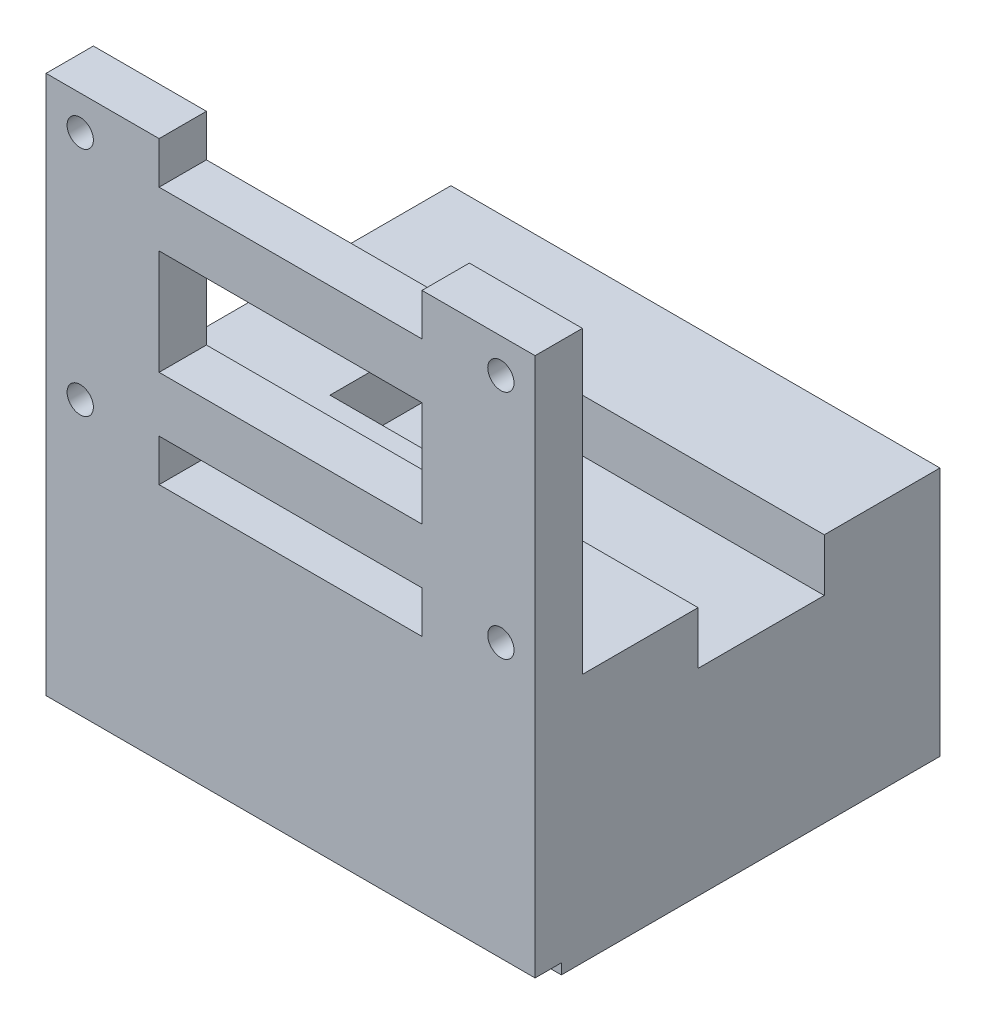
ISO-10303-21;
HEADER;
FILE_DESCRIPTION(('STEP AP214'),'2;1');
FILE_NAME('part.step','',(''),(''),'','','');
FILE_SCHEMA(('AUTOMOTIVE_DESIGN { 1 0 10303 214 1 1 1 1 }'));
ENDSEC;
DATA;
#1=APPLICATION_CONTEXT('core data for automotive mechanical design processes');
#2=APPLICATION_PROTOCOL_DEFINITION('international standard','automotive_design',2000,#1);
#3=PRODUCT_CONTEXT('',#1,'mechanical');
#4=PRODUCT('Part','Part','',(#3));
#5=PRODUCT_RELATED_PRODUCT_CATEGORY('part','',(#4));
#6=PRODUCT_DEFINITION_FORMATION('','',#4);
#7=PRODUCT_DEFINITION_CONTEXT('part definition',#1,'design');
#8=PRODUCT_DEFINITION('design','',#6,#7);
#9=PRODUCT_DEFINITION_SHAPE('','',#8);
#10=(LENGTH_UNIT() NAMED_UNIT(*) SI_UNIT(.MILLI.,.METRE.));
#11=(NAMED_UNIT(*) PLANE_ANGLE_UNIT() SI_UNIT($,.RADIAN.));
#12=(NAMED_UNIT(*) SI_UNIT($,.STERADIAN.) SOLID_ANGLE_UNIT());
#13=UNCERTAINTY_MEASURE_WITH_UNIT(LENGTH_MEASURE(1.E-05),#10,'distance_accuracy_value','');
#14=(GEOMETRIC_REPRESENTATION_CONTEXT(3) GLOBAL_UNCERTAINTY_ASSIGNED_CONTEXT((#13)) GLOBAL_UNIT_ASSIGNED_CONTEXT((#10,
#11,#12)) REPRESENTATION_CONTEXT('',''));
#15=CARTESIAN_POINT('',(0.,0.,0.));
#16=DIRECTION('',(0.,0.,1.));
#17=DIRECTION('',(1.,0.,0.));
#18=AXIS2_PLACEMENT_3D('',#15,#16,#17);
#19=CARTESIAN_POINT('',(-23.25,42.25,19.));
#20=DIRECTION('',(0.,-1.,0.));
#21=DIRECTION('',(0.,0.,-1.));
#22=AXIS2_PLACEMENT_3D('',#19,#20,#21);
#23=PLANE('',#22);
#24=DIRECTION('',(-1.,0.,0.));
#25=VECTOR('',#24,1.);
#26=CARTESIAN_POINT('',(-23.25,42.25,17.));
#27=LINE('',#26,#25);
#28=CARTESIAN_POINT('',(23.25,42.25,17.));
#29=VERTEX_POINT('',#28);
#30=CARTESIAN_POINT('',(12.5,42.25,17.));
#31=VERTEX_POINT('',#30);
#32=EDGE_CURVE('E497',#29,#31,#27,.T.);
#33=ORIENTED_EDGE('',*,*,#32,.T.);
#34=DIRECTION('',(0.,0.,-1.));
#35=VECTOR('',#34,1.);
#36=CARTESIAN_POINT('',(12.5,42.25,27.));
#37=LINE('',#36,#35);
#38=CARTESIAN_POINT('',(12.5,42.25,21.5));
#39=VERTEX_POINT('',#38);
#40=EDGE_CURVE('E322',#39,#31,#37,.T.);
#41=ORIENTED_EDGE('',*,*,#40,.F.);
#42=DIRECTION('',(-1.,0.,0.));
#43=VECTOR('',#42,1.);
#44=CARTESIAN_POINT('',(23.25,42.25,21.5));
#45=LINE('',#44,#43);
#46=CARTESIAN_POINT('',(23.25,42.25,21.5));
#47=VERTEX_POINT('',#46);
#48=EDGE_CURVE('E378',#47,#39,#45,.T.);
#49=ORIENTED_EDGE('',*,*,#48,.F.);
#50=DIRECTION('',(0.,0.,-1.));
#51=VECTOR('',#50,1.);
#52=CARTESIAN_POINT('',(23.25,42.25,19.));
#53=LINE('',#52,#51);
#54=EDGE_CURVE('E513',#47,#29,#53,.T.);
#55=ORIENTED_EDGE('',*,*,#54,.T.);
#56=EDGE_LOOP('',(#33,#41,#49,#55));
#57=FACE_BOUND('',#56,.T.);
#58=ADVANCED_FACE('F42',(#57),#23,.F.);
#59=CARTESIAN_POINT('',(0.,0.,19.));
#60=DIRECTION('',(0.,0.,-1.));
#61=DIRECTION('',(-1.,0.,0.));
#62=AXIS2_PLACEMENT_3D('',#59,#60,#61);
#63=PLANE('',#62);
#64=DIRECTION('',(1.,0.,0.));
#65=VECTOR('',#64,1.);
#66=CARTESIAN_POINT('',(23.25,-9.,19.));
#67=LINE('',#66,#65);
#68=CARTESIAN_POINT('',(-23.25,-9.,19.));
#69=VERTEX_POINT('',#68);
#70=CARTESIAN_POINT('',(23.25,-9.,19.));
#71=VERTEX_POINT('',#70);
#72=EDGE_CURVE('E395',#69,#71,#67,.T.);
#73=ORIENTED_EDGE('',*,*,#72,.F.);
#74=DIRECTION('',(0.,-1.,0.));
#75=VECTOR('',#74,1.);
#76=CARTESIAN_POINT('',(-23.25,0.,19.));
#77=LINE('',#76,#75);
#78=CARTESIAN_POINT('',(-23.25,-10.,19.));
#79=VERTEX_POINT('',#78);
#80=EDGE_CURVE('E493',#69,#79,#77,.T.);
#81=ORIENTED_EDGE('',*,*,#80,.T.);
#82=DIRECTION('',(-1.,0.,0.));
#83=VECTOR('',#82,1.);
#84=CARTESIAN_POINT('',(0.,-10.,19.));
#85=LINE('',#84,#83);
#86=CARTESIAN_POINT('',(23.25,-10.,19.));
#87=VERTEX_POINT('',#86);
#88=EDGE_CURVE('E430',#87,#79,#85,.T.);
#89=ORIENTED_EDGE('',*,*,#88,.F.);
#90=DIRECTION('',(0.,1.,0.));
#91=VECTOR('',#90,1.);
#92=CARTESIAN_POINT('',(23.25,0.,19.));
#93=LINE('',#92,#91);
#94=EDGE_CURVE('E496',#87,#71,#93,.T.);
#95=ORIENTED_EDGE('',*,*,#94,.T.);
#96=EDGE_LOOP('',(#73,#81,#89,#95));
#97=FACE_BOUND('',#96,.T.);
#98=ADVANCED_FACE('F593',(#97),#63,.F.);
#99=CARTESIAN_POINT('',(23.25,13.75,17.));
#100=DIRECTION('',(-1.,0.,0.));
#101=DIRECTION('',(0.,0.,1.));
#102=AXIS2_PLACEMENT_3D('',#99,#100,#101);
#103=PLANE('',#102);
#104=DIRECTION('',(0.,0.,-1.));
#105=VECTOR('',#104,1.);
#106=CARTESIAN_POINT('',(23.25,8.75,-6.));
#107=LINE('',#106,#105);
#108=CARTESIAN_POINT('',(23.25,8.75,6.));
#109=VERTEX_POINT('',#108);
#110=CARTESIAN_POINT('',(23.25,8.75,-6.));
#111=VERTEX_POINT('',#110);
#112=EDGE_CURVE('E453',#109,#111,#107,.T.);
#113=ORIENTED_EDGE('',*,*,#112,.F.);
#114=DIRECTION('',(0.,1.,0.));
#115=VECTOR('',#114,1.);
#116=CARTESIAN_POINT('',(23.25,8.75,6.));
#117=LINE('',#116,#115);
#118=CARTESIAN_POINT('',(23.25,13.75,6.));
#119=VERTEX_POINT('',#118);
#120=EDGE_CURVE('E480',#109,#119,#117,.T.);
#121=ORIENTED_EDGE('',*,*,#120,.T.);
#122=DIRECTION('',(0.,0.,-1.));
#123=VECTOR('',#122,1.);
#124=CARTESIAN_POINT('',(23.25,13.75,17.));
#125=LINE('',#124,#123);
#126=CARTESIAN_POINT('',(23.25,13.75,17.));
#127=VERTEX_POINT('',#126);
#128=EDGE_CURVE('E518',#127,#119,#125,.T.);
#129=ORIENTED_EDGE('',*,*,#128,.F.);
#130=DIRECTION('',(0.,1.,0.));
#131=VECTOR('',#130,1.);
#132=CARTESIAN_POINT('',(23.25,0.,17.));
#133=LINE('',#132,#131);
#134=EDGE_CURVE('E503',#127,#29,#133,.T.);
#135=ORIENTED_EDGE('',*,*,#134,.T.);
#136=ORIENTED_EDGE('',*,*,#54,.F.);
#137=DIRECTION('',(0.,-1.,0.));
#138=VECTOR('',#137,1.);
#139=CARTESIAN_POINT('',(23.25,42.25,21.5));
#140=LINE('',#139,#138);
#141=CARTESIAN_POINT('',(23.25,-9.,21.5));
#142=VERTEX_POINT('',#141);
#143=EDGE_CURVE('E382',#47,#142,#140,.T.);
#144=ORIENTED_EDGE('',*,*,#143,.T.);
#145=DIRECTION('',(0.,0.,1.));
#146=VECTOR('',#145,1.);
#147=CARTESIAN_POINT('',(23.25,-9.,19.));
#148=LINE('',#147,#146);
#149=EDGE_CURVE('E261',#71,#142,#148,.T.);
#150=ORIENTED_EDGE('',*,*,#149,.F.);
#151=ORIENTED_EDGE('',*,*,#94,.F.);
#152=DIRECTION('',(0.,0.,1.));
#153=VECTOR('',#152,1.);
#154=CARTESIAN_POINT('',(23.25,-10.,0.));
#155=LINE('',#154,#153);
#156=CARTESIAN_POINT('',(23.25,-10.,-17.));
#157=VERTEX_POINT('',#156);
#158=EDGE_CURVE('E426',#157,#87,#155,.T.);
#159=ORIENTED_EDGE('',*,*,#158,.F.);
#160=DIRECTION('',(0.,-1.,0.));
#161=VECTOR('',#160,1.);
#162=CARTESIAN_POINT('',(23.25,13.75,-17.));
#163=LINE('',#162,#161);
#164=CARTESIAN_POINT('',(23.25,13.75,-17.));
#165=VERTEX_POINT('',#164);
#166=EDGE_CURVE('E236',#165,#157,#163,.T.);
#167=ORIENTED_EDGE('',*,*,#166,.F.);
#168=CARTESIAN_POINT('',(23.25,13.75,-6.));
#169=VERTEX_POINT('',#168);
#170=EDGE_CURVE('E517',#169,#165,#125,.T.);
#171=ORIENTED_EDGE('',*,*,#170,.F.);
#172=DIRECTION('',(0.,1.,0.));
#173=VECTOR('',#172,1.);
#174=CARTESIAN_POINT('',(23.25,8.75,-6.));
#175=LINE('',#174,#173);
#176=EDGE_CURVE('E470',#111,#169,#175,.T.);
#177=ORIENTED_EDGE('',*,*,#176,.F.);
#178=EDGE_LOOP('',(#113,#121,#129,#135,#136,#144,#150,#151,#159,#167,#171,#177));
#179=FACE_BOUND('',#178,.T.);
#180=ADVANCED_FACE('F44',(#179),#103,.F.);
#181=CARTESIAN_POINT('',(-23.25,13.75,-17.));
#182=DIRECTION('',(0.,0.,1.));
#183=DIRECTION('',(1.,0.,0.));
#184=AXIS2_PLACEMENT_3D('',#181,#182,#183);
#185=PLANE('',#184);
#186=ORIENTED_EDGE('',*,*,#166,.T.);
#187=DIRECTION('',(1.,0.,0.));
#188=VECTOR('',#187,1.);
#189=CARTESIAN_POINT('',(0.,-10.,-17.));
#190=LINE('',#189,#188);
#191=CARTESIAN_POINT('',(-23.25,-10.,-17.));
#192=VERTEX_POINT('',#191);
#193=EDGE_CURVE('E422',#192,#157,#190,.T.);
#194=ORIENTED_EDGE('',*,*,#193,.F.);
#195=DIRECTION('',(0.,-1.,0.));
#196=VECTOR('',#195,1.);
#197=CARTESIAN_POINT('',(-23.25,13.75,-17.));
#198=LINE('',#197,#196);
#199=CARTESIAN_POINT('',(-23.25,13.75,-17.));
#200=VERTEX_POINT('',#199);
#201=EDGE_CURVE('E231',#200,#192,#198,.T.);
#202=ORIENTED_EDGE('',*,*,#201,.F.);
#203=DIRECTION('',(-1.,0.,0.));
#204=VECTOR('',#203,1.);
#205=CARTESIAN_POINT('',(-23.25,13.75,-17.));
#206=LINE('',#205,#204);
#207=EDGE_CURVE('E520',#165,#200,#206,.T.);
#208=ORIENTED_EDGE('',*,*,#207,.F.);
#209=EDGE_LOOP('',(#186,#194,#202,#208));
#210=FACE_BOUND('',#209,.T.);
#211=ADVANCED_FACE('F530',(#210),#185,.F.);
#212=CARTESIAN_POINT('',(-23.25,13.75,17.));
#213=DIRECTION('',(1.,0.,0.));
#214=DIRECTION('',(0.,0.,-1.));
#215=AXIS2_PLACEMENT_3D('',#212,#213,#214);
#216=PLANE('',#215);
#217=ORIENTED_EDGE('',*,*,#201,.T.);
#218=DIRECTION('',(0.,0.,-1.));
#219=VECTOR('',#218,1.);
#220=CARTESIAN_POINT('',(-23.25,-10.,0.));
#221=LINE('',#220,#219);
#222=EDGE_CURVE('E434',#79,#192,#221,.T.);
#223=ORIENTED_EDGE('',*,*,#222,.F.);
#224=ORIENTED_EDGE('',*,*,#80,.F.);
#225=DIRECTION('',(0.,0.,-1.));
#226=VECTOR('',#225,1.);
#227=CARTESIAN_POINT('',(-23.25,-9.,19.));
#228=LINE('',#227,#226);
#229=CARTESIAN_POINT('',(-23.25,-9.,21.5));
#230=VERTEX_POINT('',#229);
#231=EDGE_CURVE('E391',#230,#69,#228,.T.);
#232=ORIENTED_EDGE('',*,*,#231,.F.);
#233=DIRECTION('',(0.,-1.,0.));
#234=VECTOR('',#233,1.);
#235=CARTESIAN_POINT('',(-23.25,42.25,21.5));
#236=LINE('',#235,#234);
#237=CARTESIAN_POINT('',(-23.25,42.25,21.5));
#238=VERTEX_POINT('',#237);
#239=EDGE_CURVE('E399',#238,#230,#236,.T.);
#240=ORIENTED_EDGE('',*,*,#239,.F.);
#241=DIRECTION('',(0.,0.,-1.));
#242=VECTOR('',#241,1.);
#243=CARTESIAN_POINT('',(-23.25,42.25,19.));
#244=LINE('',#243,#242);
#245=CARTESIAN_POINT('',(-23.25,42.25,17.));
#246=VERTEX_POINT('',#245);
#247=EDGE_CURVE('E500',#238,#246,#244,.T.);
#248=ORIENTED_EDGE('',*,*,#247,.T.);
#249=DIRECTION('',(0.,-1.,0.));
#250=VECTOR('',#249,1.);
#251=CARTESIAN_POINT('',(-23.25,0.,17.));
#252=LINE('',#251,#250);
#253=CARTESIAN_POINT('',(-23.25,13.75,17.));
#254=VERTEX_POINT('',#253);
#255=EDGE_CURVE('E484',#246,#254,#252,.T.);
#256=ORIENTED_EDGE('',*,*,#255,.T.);
#257=DIRECTION('',(0.,0.,1.));
#258=VECTOR('',#257,1.);
#259=CARTESIAN_POINT('',(-23.25,13.75,17.));
#260=LINE('',#259,#258);
#261=EDGE_CURVE('E229',#200,#254,#260,.T.);
#262=ORIENTED_EDGE('',*,*,#261,.F.);
#263=EDGE_LOOP('',(#217,#223,#224,#232,#240,#248,#256,#262));
#264=FACE_BOUND('',#263,.T.);
#265=ADVANCED_FACE('F533',(#264),#216,.F.);
#266=CARTESIAN_POINT('',(0.,13.75,0.));
#267=DIRECTION('',(0.,-1.,0.));
#268=DIRECTION('',(0.,0.,-1.));
#269=AXIS2_PLACEMENT_3D('',#266,#267,#268);
#270=PLANE('',#269);
#271=ORIENTED_EDGE('',*,*,#128,.T.);
#272=DIRECTION('',(1.,0.,0.));
#273=VECTOR('',#272,1.);
#274=CARTESIAN_POINT('',(23.25,13.75,6.));
#275=LINE('',#274,#273);
#276=CARTESIAN_POINT('',(-11.75,13.75,6.00000000000001));
#277=VERTEX_POINT('',#276);
#278=EDGE_CURVE('E458',#277,#119,#275,.T.);
#279=ORIENTED_EDGE('',*,*,#278,.F.);
#280=DIRECTION('',(0.,0.,1.));
#281=VECTOR('',#280,1.);
#282=CARTESIAN_POINT('',(-11.75,13.75,-5.99999999999999));
#283=LINE('',#282,#281);
#284=CARTESIAN_POINT('',(-11.75,13.75,-5.99999999999999));
#285=VERTEX_POINT('',#284);
#286=EDGE_CURVE('E474',#285,#277,#283,.T.);
#287=ORIENTED_EDGE('',*,*,#286,.F.);
#288=DIRECTION('',(-1.,0.,0.));
#289=VECTOR('',#288,1.);
#290=CARTESIAN_POINT('',(23.25,13.75,-6.));
#291=LINE('',#290,#289);
#292=EDGE_CURVE('E438',#169,#285,#291,.T.);
#293=ORIENTED_EDGE('',*,*,#292,.F.);
#294=ORIENTED_EDGE('',*,*,#170,.T.);
#295=ORIENTED_EDGE('',*,*,#207,.T.);
#296=ORIENTED_EDGE('',*,*,#261,.T.);
#297=DIRECTION('',(1.,0.,0.));
#298=VECTOR('',#297,1.);
#299=CARTESIAN_POINT('',(-23.25,13.75,17.));
#300=LINE('',#299,#298);
#301=CARTESIAN_POINT('',(-12.5,13.75,17.));
#302=VERTEX_POINT('',#301);
#303=EDGE_CURVE('E219',#254,#302,#300,.T.);
#304=ORIENTED_EDGE('',*,*,#303,.T.);
#305=DIRECTION('',(0.,0.,-1.));
#306=VECTOR('',#305,1.);
#307=CARTESIAN_POINT('',(-12.5,13.75,27.));
#308=LINE('',#307,#306);
#309=CARTESIAN_POINT('',(-12.5,13.75,21.5));
#310=VERTEX_POINT('',#309);
#311=EDGE_CURVE('E66',#310,#302,#308,.T.);
#312=ORIENTED_EDGE('',*,*,#311,.F.);
#313=DIRECTION('',(1.,0.,0.));
#314=VECTOR('',#313,1.);
#315=CARTESIAN_POINT('',(23.25,13.75,21.5));
#316=LINE('',#315,#314);
#317=CARTESIAN_POINT('',(12.5,13.75,21.5));
#318=VERTEX_POINT('',#317);
#319=EDGE_CURVE('E287',#310,#318,#316,.T.);
#320=ORIENTED_EDGE('',*,*,#319,.T.);
#321=DIRECTION('',(0.,0.,-1.));
#322=VECTOR('',#321,1.);
#323=CARTESIAN_POINT('',(12.5,13.75,27.));
#324=LINE('',#323,#322);
#325=CARTESIAN_POINT('',(12.5,13.75,17.));
#326=VERTEX_POINT('',#325);
#327=EDGE_CURVE('E213',#318,#326,#324,.T.);
#328=ORIENTED_EDGE('',*,*,#327,.T.);
#329=EDGE_CURVE('E232',#326,#127,#300,.T.);
#330=ORIENTED_EDGE('',*,*,#329,.T.);
#331=EDGE_LOOP('',(#271,#279,#287,#293,#294,#295,#296,#304,#312,#320,#328,#330));
#332=FACE_BOUND('',#331,.T.);
#333=ADVANCED_FACE('F227',(#332),#270,.F.);
#334=CARTESIAN_POINT('',(0.,0.,17.));
#335=DIRECTION('',(0.,0.,-1.));
#336=DIRECTION('',(-1.,0.,0.));
#337=AXIS2_PLACEMENT_3D('',#334,#335,#336);
#338=PLANE('',#337);
#339=DIRECTION('',(0.,-1.,0.));
#340=VECTOR('',#339,1.);
#341=CARTESIAN_POINT('',(12.5,13.75,17.));
#342=LINE('',#341,#340);
#343=CARTESIAN_POINT('',(12.5,17.75,17.));
#344=VERTEX_POINT('',#343);
#345=EDGE_CURVE('E58',#344,#326,#342,.T.);
#346=ORIENTED_EDGE('',*,*,#345,.F.);
#347=DIRECTION('',(1.,0.,0.));
#348=VECTOR('',#347,1.);
#349=CARTESIAN_POINT('',(12.5,17.75,17.));
#350=LINE('',#349,#348);
#351=CARTESIAN_POINT('',(-12.5,17.75,17.));
#352=VERTEX_POINT('',#351);
#353=EDGE_CURVE('E222',#352,#344,#350,.T.);
#354=ORIENTED_EDGE('',*,*,#353,.F.);
#355=DIRECTION('',(0.,1.,0.));
#356=VECTOR('',#355,1.);
#357=CARTESIAN_POINT('',(-12.5,13.75,17.));
#358=LINE('',#357,#356);
#359=EDGE_CURVE('E206',#302,#352,#358,.T.);
#360=ORIENTED_EDGE('',*,*,#359,.F.);
#361=ORIENTED_EDGE('',*,*,#303,.F.);
#362=ORIENTED_EDGE('',*,*,#255,.F.);
#363=CARTESIAN_POINT('',(-12.5,42.25,17.));
#364=VERTEX_POINT('',#363);
#365=EDGE_CURVE('E506',#364,#246,#27,.T.);
#366=ORIENTED_EDGE('',*,*,#365,.F.);
#367=DIRECTION('',(0.,1.,0.));
#368=VECTOR('',#367,1.);
#369=CARTESIAN_POINT('',(-12.5,42.25,17.));
#370=LINE('',#369,#368);
#371=CARTESIAN_POINT('',(-12.5,38.25,17.));
#372=VERTEX_POINT('',#371);
#373=EDGE_CURVE('E318',#372,#364,#370,.T.);
#374=ORIENTED_EDGE('',*,*,#373,.F.);
#375=DIRECTION('',(-1.,0.,0.));
#376=VECTOR('',#375,1.);
#377=CARTESIAN_POINT('',(12.5,38.25,17.));
#378=LINE('',#377,#376);
#379=CARTESIAN_POINT('',(12.5,38.25,17.));
#380=VERTEX_POINT('',#379);
#381=EDGE_CURVE('E314',#380,#372,#378,.T.);
#382=ORIENTED_EDGE('',*,*,#381,.F.);
#383=DIRECTION('',(0.,-1.,0.));
#384=VECTOR('',#383,1.);
#385=CARTESIAN_POINT('',(12.5,42.25,17.));
#386=LINE('',#385,#384);
#387=EDGE_CURVE('E310',#31,#380,#386,.T.);
#388=ORIENTED_EDGE('',*,*,#387,.F.);
#389=ORIENTED_EDGE('',*,*,#32,.F.);
#390=ORIENTED_EDGE('',*,*,#134,.F.);
#391=ORIENTED_EDGE('',*,*,#329,.F.);
#392=EDGE_LOOP('',(#346,#354,#360,#361,#362,#366,#374,#382,#388,#389,#390,#391));
#393=FACE_BOUND('',#392,.T.);
#394=DIRECTION('',(-1.,0.,0.));
#395=VECTOR('',#394,1.);
#396=CARTESIAN_POINT('',(-12.5,33.,17.));
#397=LINE('',#396,#395);
#398=CARTESIAN_POINT('',(12.5,33.,17.));
#399=VERTEX_POINT('',#398);
#400=CARTESIAN_POINT('',(-12.5,33.,17.));
#401=VERTEX_POINT('',#400);
#402=EDGE_CURVE('E351',#399,#401,#397,.T.);
#403=ORIENTED_EDGE('',*,*,#402,.T.);
#404=DIRECTION('',(0.,-1.,0.));
#405=VECTOR('',#404,1.);
#406=CARTESIAN_POINT('',(-12.5,33.,17.));
#407=LINE('',#406,#405);
#408=CARTESIAN_POINT('',(-12.5,23.,17.));
#409=VERTEX_POINT('',#408);
#410=EDGE_CURVE('E355',#401,#409,#407,.T.);
#411=ORIENTED_EDGE('',*,*,#410,.T.);
#412=DIRECTION('',(1.,0.,0.));
#413=VECTOR('',#412,1.);
#414=CARTESIAN_POINT('',(-12.5,23.,17.));
#415=LINE('',#414,#413);
#416=CARTESIAN_POINT('',(12.5,23.,17.));
#417=VERTEX_POINT('',#416);
#418=EDGE_CURVE('E359',#409,#417,#415,.T.);
#419=ORIENTED_EDGE('',*,*,#418,.T.);
#420=DIRECTION('',(0.,1.,0.));
#421=VECTOR('',#420,1.);
#422=CARTESIAN_POINT('',(12.5,33.,17.));
#423=LINE('',#422,#421);
#424=EDGE_CURVE('E347',#417,#399,#423,.T.);
#425=ORIENTED_EDGE('',*,*,#424,.T.);
#426=EDGE_LOOP('',(#403,#411,#419,#425));
#427=FACE_BOUND('',#426,.T.);
#428=CARTESIAN_POINT('',(-20.,17.,17.));
#429=DIRECTION('',(0.,0.,-1.));
#430=DIRECTION('',(-1.,0.,0.));
#431=AXIS2_PLACEMENT_3D('',#428,#429,#430);
#432=CIRCLE('',#431,1.25);
#433=CARTESIAN_POINT('',(-21.25,17.,17.));
#434=VERTEX_POINT('',#433);
#435=EDGE_CURVE('E342',#434,#434,#432,.F.);
#436=ORIENTED_EDGE('',*,*,#435,.T.);
#437=EDGE_LOOP('',(#436));
#438=FACE_BOUND('',#437,.T.);
#439=CARTESIAN_POINT('',(20.,39.,17.));
#440=DIRECTION('',(0.,0.,-1.));
#441=DIRECTION('',(-1.,0.,0.));
#442=AXIS2_PLACEMENT_3D('',#439,#440,#441);
#443=CIRCLE('',#442,1.25);
#444=CARTESIAN_POINT('',(18.75,39.,17.));
#445=VERTEX_POINT('',#444);
#446=EDGE_CURVE('E338',#445,#445,#443,.F.);
#447=ORIENTED_EDGE('',*,*,#446,.T.);
#448=EDGE_LOOP('',(#447));
#449=FACE_BOUND('',#448,.T.);
#450=CARTESIAN_POINT('',(20.,17.,17.));
#451=DIRECTION('',(0.,0.,-1.));
#452=DIRECTION('',(-1.,0.,0.));
#453=AXIS2_PLACEMENT_3D('',#450,#451,#452);
#454=CIRCLE('',#453,1.25);
#455=CARTESIAN_POINT('',(18.75,17.,17.));
#456=VERTEX_POINT('',#455);
#457=EDGE_CURVE('E334',#456,#456,#454,.F.);
#458=ORIENTED_EDGE('',*,*,#457,.T.);
#459=EDGE_LOOP('',(#458));
#460=FACE_BOUND('',#459,.T.);
#461=CARTESIAN_POINT('',(-20.,39.,17.));
#462=DIRECTION('',(0.,0.,-1.));
#463=DIRECTION('',(-1.,0.,0.));
#464=AXIS2_PLACEMENT_3D('',#461,#462,#463);
#465=CIRCLE('',#464,1.25);
#466=CARTESIAN_POINT('',(-21.25,39.,17.));
#467=VERTEX_POINT('',#466);
#468=EDGE_CURVE('E249',#467,#467,#465,.F.);
#469=ORIENTED_EDGE('',*,*,#468,.T.);
#470=EDGE_LOOP('',(#469));
#471=FACE_BOUND('',#470,.T.);
#472=ADVANCED_FACE('F216',(#393,#427,#438,#449,#460,#471),#338,.T.);
#473=CARTESIAN_POINT('',(-12.5,42.25,21.5));
#474=VERTEX_POINT('',#473);
#475=EDGE_CURVE('E383',#474,#238,#45,.T.);
#476=ORIENTED_EDGE('',*,*,#475,.F.);
#477=DIRECTION('',(0.,0.,-1.));
#478=VECTOR('',#477,1.);
#479=CARTESIAN_POINT('',(-12.5,42.25,27.));
#480=LINE('',#479,#478);
#481=EDGE_CURVE('E325',#474,#364,#480,.T.);
#482=ORIENTED_EDGE('',*,*,#481,.T.);
#483=ORIENTED_EDGE('',*,*,#365,.T.);
#484=ORIENTED_EDGE('',*,*,#247,.F.);
#485=EDGE_LOOP('',(#476,#482,#483,#484));
#486=FACE_BOUND('',#485,.T.);
#487=ADVANCED_FACE('F582',(#486),#23,.F.);
#488=CARTESIAN_POINT('',(23.25,8.75,6.));
#489=DIRECTION('',(0.,0.,1.));
#490=DIRECTION('',(1.,0.,0.));
#491=AXIS2_PLACEMENT_3D('',#488,#489,#490);
#492=PLANE('',#491);
#493=ORIENTED_EDGE('',*,*,#278,.T.);
#494=ORIENTED_EDGE('',*,*,#120,.F.);
#495=DIRECTION('',(1.,0.,0.));
#496=VECTOR('',#495,1.);
#497=CARTESIAN_POINT('',(23.25,8.75,6.));
#498=LINE('',#497,#496);
#499=CARTESIAN_POINT('',(-11.75,8.75,6.00000000000001));
#500=VERTEX_POINT('',#499);
#501=EDGE_CURVE('E466',#500,#109,#498,.T.);
#502=ORIENTED_EDGE('',*,*,#501,.F.);
#503=DIRECTION('',(0.,1.,0.));
#504=VECTOR('',#503,1.);
#505=CARTESIAN_POINT('',(-11.75,8.75,6.00000000000001));
#506=LINE('',#505,#504);
#507=EDGE_CURVE('E485',#500,#277,#506,.T.);
#508=ORIENTED_EDGE('',*,*,#507,.T.);
#509=EDGE_LOOP('',(#493,#494,#502,#508));
#510=FACE_BOUND('',#509,.T.);
#511=ADVANCED_FACE('F556',(#510),#492,.F.);
#512=CARTESIAN_POINT('',(-11.75,8.75,-5.99999999999999));
#513=DIRECTION('',(-1.,0.,0.));
#514=DIRECTION('',(0.,0.,1.));
#515=AXIS2_PLACEMENT_3D('',#512,#513,#514);
#516=PLANE('',#515);
#517=ORIENTED_EDGE('',*,*,#286,.T.);
#518=ORIENTED_EDGE('',*,*,#507,.F.);
#519=DIRECTION('',(0.,0.,1.));
#520=VECTOR('',#519,1.);
#521=CARTESIAN_POINT('',(-11.75,8.75,-5.99999999999999));
#522=LINE('',#521,#520);
#523=CARTESIAN_POINT('',(-11.75,8.75,-5.99999999999999));
#524=VERTEX_POINT('',#523);
#525=EDGE_CURVE('E462',#524,#500,#522,.T.);
#526=ORIENTED_EDGE('',*,*,#525,.F.);
#527=DIRECTION('',(0.,1.,0.));
#528=VECTOR('',#527,1.);
#529=CARTESIAN_POINT('',(-11.75,8.75,-5.99999999999999));
#530=LINE('',#529,#528);
#531=EDGE_CURVE('E488',#524,#285,#530,.T.);
#532=ORIENTED_EDGE('',*,*,#531,.T.);
#533=EDGE_LOOP('',(#517,#518,#526,#532));
#534=FACE_BOUND('',#533,.T.);
#535=ADVANCED_FACE('F561',(#534),#516,.F.);
#536=CARTESIAN_POINT('',(23.25,8.75,-6.));
#537=DIRECTION('',(0.,0.,-1.));
#538=DIRECTION('',(-1.,0.,0.));
#539=AXIS2_PLACEMENT_3D('',#536,#537,#538);
#540=PLANE('',#539);
#541=ORIENTED_EDGE('',*,*,#292,.T.);
#542=ORIENTED_EDGE('',*,*,#531,.F.);
#543=DIRECTION('',(-1.,0.,0.));
#544=VECTOR('',#543,1.);
#545=CARTESIAN_POINT('',(23.25,8.75,-6.));
#546=LINE('',#545,#544);
#547=EDGE_CURVE('E457',#111,#524,#546,.T.);
#548=ORIENTED_EDGE('',*,*,#547,.F.);
#549=ORIENTED_EDGE('',*,*,#176,.T.);
#550=EDGE_LOOP('',(#541,#542,#548,#549));
#551=FACE_BOUND('',#550,.T.);
#552=ADVANCED_FACE('F677',(#551),#540,.F.);
#553=CARTESIAN_POINT('',(0.,8.75,0.));
#554=DIRECTION('',(0.,-1.,0.));
#555=DIRECTION('',(0.,0.,-1.));
#556=AXIS2_PLACEMENT_3D('',#553,#554,#555);
#557=PLANE('',#556);
#558=ORIENTED_EDGE('',*,*,#112,.T.);
#559=ORIENTED_EDGE('',*,*,#547,.T.);
#560=ORIENTED_EDGE('',*,*,#525,.T.);
#561=ORIENTED_EDGE('',*,*,#501,.T.);
#562=EDGE_LOOP('',(#558,#559,#560,#561));
#563=FACE_BOUND('',#562,.T.);
#564=ADVANCED_FACE('F558',(#563),#557,.F.);
#565=CARTESIAN_POINT('',(16.25,-10.,-10.));
#566=DIRECTION('',(0.,1.,0.));
#567=DIRECTION('',(0.,0.,1.));
#568=AXIS2_PLACEMENT_3D('',#565,#566,#567);
#569=CYLINDRICAL_SURFACE('',#568,2.);
#570=CARTESIAN_POINT('',(16.25,-10.,-10.));
#571=DIRECTION('',(0.,-1.,0.));
#572=DIRECTION('',(0.,0.,-1.));
#573=AXIS2_PLACEMENT_3D('',#570,#571,#572);
#574=CIRCLE('',#573,2.);
#575=CARTESIAN_POINT('',(16.25,-10.,-12.));
#576=VERTEX_POINT('',#575);
#577=EDGE_CURVE('E418',#576,#576,#574,.T.);
#578=ORIENTED_EDGE('',*,*,#577,.T.);
#579=EDGE_LOOP('',(#578));
#580=FACE_BOUND('',#579,.T.);
#581=CARTESIAN_POINT('',(16.25,0.,-10.));
#582=DIRECTION('',(0.,-1.,0.));
#583=DIRECTION('',(0.,0.,-1.));
#584=AXIS2_PLACEMENT_3D('',#581,#582,#583);
#585=CIRCLE('',#584,2.);
#586=CARTESIAN_POINT('',(16.25,0.,-12.));
#587=VERTEX_POINT('',#586);
#588=EDGE_CURVE('E410',#587,#587,#585,.T.);
#589=ORIENTED_EDGE('',*,*,#588,.F.);
#590=EDGE_LOOP('',(#589));
#591=FACE_BOUND('',#590,.T.);
#592=ADVANCED_FACE('F661',(#580,#591),#569,.F.);
#593=CARTESIAN_POINT('',(16.25,-10.,12.));
#594=DIRECTION('',(0.,1.,0.));
#595=DIRECTION('',(0.,0.,1.));
#596=AXIS2_PLACEMENT_3D('',#593,#594,#595);
#597=CYLINDRICAL_SURFACE('',#596,2.);
#598=CARTESIAN_POINT('',(16.25,-10.,12.));
#599=DIRECTION('',(0.,-1.,0.));
#600=DIRECTION('',(0.,0.,-1.));
#601=AXIS2_PLACEMENT_3D('',#598,#599,#600);
#602=CIRCLE('',#601,2.);
#603=CARTESIAN_POINT('',(16.25,-10.,10.));
#604=VERTEX_POINT('',#603);
#605=EDGE_CURVE('E414',#604,#604,#602,.T.);
#606=ORIENTED_EDGE('',*,*,#605,.T.);
#607=EDGE_LOOP('',(#606));
#608=FACE_BOUND('',#607,.T.);
#609=CARTESIAN_POINT('',(16.25,0.,12.));
#610=DIRECTION('',(0.,-1.,0.));
#611=DIRECTION('',(0.,0.,-1.));
#612=AXIS2_PLACEMENT_3D('',#609,#610,#611);
#613=CIRCLE('',#612,2.);
#614=CARTESIAN_POINT('',(16.25,0.,10.));
#615=VERTEX_POINT('',#614);
#616=EDGE_CURVE('E446',#615,#615,#613,.T.);
#617=ORIENTED_EDGE('',*,*,#616,.F.);
#618=EDGE_LOOP('',(#617));
#619=FACE_BOUND('',#618,.T.);
#620=ADVANCED_FACE('F664',(#608,#619),#597,.F.);
#621=CARTESIAN_POINT('',(-16.25,-10.,-10.));
#622=DIRECTION('',(0.,1.,0.));
#623=DIRECTION('',(0.,0.,1.));
#624=AXIS2_PLACEMENT_3D('',#621,#622,#623);
#625=CYLINDRICAL_SURFACE('',#624,2.);
#626=CARTESIAN_POINT('',(-16.25,-10.,-10.));
#627=DIRECTION('',(0.,-1.,0.));
#628=DIRECTION('',(0.,0.,-1.));
#629=AXIS2_PLACEMENT_3D('',#626,#627,#628);
#630=CIRCLE('',#629,2.);
#631=CARTESIAN_POINT('',(-16.25,-10.,-12.));
#632=VERTEX_POINT('',#631);
#633=EDGE_CURVE('E409',#632,#632,#630,.T.);
#634=ORIENTED_EDGE('',*,*,#633,.T.);
#635=EDGE_LOOP('',(#634));
#636=FACE_BOUND('',#635,.T.);
#637=CARTESIAN_POINT('',(-16.25,0.,-10.));
#638=DIRECTION('',(0.,-1.,0.));
#639=DIRECTION('',(0.,0.,-1.));
#640=AXIS2_PLACEMENT_3D('',#637,#638,#639);
#641=CIRCLE('',#640,2.);
#642=CARTESIAN_POINT('',(-16.25,0.,-12.));
#643=VERTEX_POINT('',#642);
#644=EDGE_CURVE('E442',#643,#643,#641,.T.);
#645=ORIENTED_EDGE('',*,*,#644,.F.);
#646=EDGE_LOOP('',(#645));
#647=FACE_BOUND('',#646,.T.);
#648=ADVANCED_FACE('F668',(#636,#647),#625,.F.);
#649=CARTESIAN_POINT('',(-16.25,-10.,12.));
#650=DIRECTION('',(0.,1.,0.));
#651=DIRECTION('',(0.,0.,1.));
#652=AXIS2_PLACEMENT_3D('',#649,#650,#651);
#653=CYLINDRICAL_SURFACE('',#652,2.);
#654=CARTESIAN_POINT('',(-16.25,-10.,12.));
#655=DIRECTION('',(0.,-1.,0.));
#656=DIRECTION('',(0.,0.,-1.));
#657=AXIS2_PLACEMENT_3D('',#654,#655,#656);
#658=CIRCLE('',#657,2.);
#659=CARTESIAN_POINT('',(-16.25,-10.,10.));
#660=VERTEX_POINT('',#659);
#661=EDGE_CURVE('E405',#660,#660,#658,.T.);
#662=ORIENTED_EDGE('',*,*,#661,.T.);
#663=EDGE_LOOP('',(#662));
#664=FACE_BOUND('',#663,.T.);
#665=CARTESIAN_POINT('',(-16.25,0.,12.));
#666=DIRECTION('',(0.,-1.,0.));
#667=DIRECTION('',(0.,0.,-1.));
#668=AXIS2_PLACEMENT_3D('',#665,#666,#667);
#669=CIRCLE('',#668,2.);
#670=CARTESIAN_POINT('',(-16.25,0.,10.));
#671=VERTEX_POINT('',#670);
#672=EDGE_CURVE('E402',#671,#671,#669,.T.);
#673=ORIENTED_EDGE('',*,*,#672,.F.);
#674=EDGE_LOOP('',(#673));
#675=FACE_BOUND('',#674,.T.);
#676=ADVANCED_FACE('F659',(#664,#675),#653,.F.);
#677=CARTESIAN_POINT('',(0.,-10.,0.));
#678=DIRECTION('',(0.,-1.,0.));
#679=DIRECTION('',(0.,0.,-1.));
#680=AXIS2_PLACEMENT_3D('',#677,#678,#679);
#681=PLANE('',#680);
#682=ORIENTED_EDGE('',*,*,#661,.F.);
#683=EDGE_LOOP('',(#682));
#684=FACE_BOUND('',#683,.T.);
#685=ORIENTED_EDGE('',*,*,#633,.F.);
#686=EDGE_LOOP('',(#685));
#687=FACE_BOUND('',#686,.T.);
#688=ORIENTED_EDGE('',*,*,#605,.F.);
#689=EDGE_LOOP('',(#688));
#690=FACE_BOUND('',#689,.T.);
#691=ORIENTED_EDGE('',*,*,#577,.F.);
#692=EDGE_LOOP('',(#691));
#693=FACE_BOUND('',#692,.T.);
#694=ORIENTED_EDGE('',*,*,#193,.T.);
#695=ORIENTED_EDGE('',*,*,#158,.T.);
#696=ORIENTED_EDGE('',*,*,#88,.T.);
#697=ORIENTED_EDGE('',*,*,#222,.T.);
#698=EDGE_LOOP('',(#694,#695,#696,#697));
#699=FACE_BOUND('',#698,.T.);
#700=ADVANCED_FACE('F568',(#684,#687,#690,#693,#699),#681,.T.);
#701=CARTESIAN_POINT('',(0.,0.,0.));
#702=DIRECTION('',(0.,-1.,0.));
#703=DIRECTION('',(0.,0.,-1.));
#704=AXIS2_PLACEMENT_3D('',#701,#702,#703);
#705=PLANE('',#704);
#706=ORIENTED_EDGE('',*,*,#616,.T.);
#707=EDGE_LOOP('',(#706));
#708=FACE_BOUND('',#707,.T.);
#709=ADVANCED_FACE('F658',(#708),#705,.T.);
#710=ORIENTED_EDGE('',*,*,#644,.T.);
#711=EDGE_LOOP('',(#710));
#712=FACE_BOUND('',#711,.T.);
#713=ADVANCED_FACE('F717',(#712),#705,.T.);
#714=ORIENTED_EDGE('',*,*,#672,.T.);
#715=EDGE_LOOP('',(#714));
#716=FACE_BOUND('',#715,.T.);
#717=ADVANCED_FACE('F725',(#716),#705,.T.);
#718=ORIENTED_EDGE('',*,*,#588,.T.);
#719=EDGE_LOOP('',(#718));
#720=FACE_BOUND('',#719,.T.);
#721=ADVANCED_FACE('F655',(#720),#705,.T.);
#722=CARTESIAN_POINT('',(23.25,42.25,21.5));
#723=DIRECTION('',(0.,0.,1.));
#724=DIRECTION('',(1.,0.,0.));
#725=AXIS2_PLACEMENT_3D('',#722,#723,#724);
#726=PLANE('',#725);
#727=DIRECTION('',(0.,1.,0.));
#728=VECTOR('',#727,1.);
#729=CARTESIAN_POINT('',(12.5,42.25,21.5));
#730=LINE('',#729,#728);
#731=CARTESIAN_POINT('',(12.5,17.75,21.5));
#732=VERTEX_POINT('',#731);
#733=EDGE_CURVE('E12',#318,#732,#730,.T.);
#734=ORIENTED_EDGE('',*,*,#733,.F.);
#735=ORIENTED_EDGE('',*,*,#319,.F.);
#736=DIRECTION('',(0.,-1.,0.));
#737=VECTOR('',#736,1.);
#738=CARTESIAN_POINT('',(-12.5,42.25,21.5));
#739=LINE('',#738,#737);
#740=CARTESIAN_POINT('',(-12.5,17.75,21.5));
#741=VERTEX_POINT('',#740);
#742=EDGE_CURVE('E209',#741,#310,#739,.T.);
#743=ORIENTED_EDGE('',*,*,#742,.F.);
#744=DIRECTION('',(-1.,0.,0.));
#745=VECTOR('',#744,1.);
#746=CARTESIAN_POINT('',(23.25,17.75,21.5));
#747=LINE('',#746,#745);
#748=EDGE_CURVE('E51',#732,#741,#747,.T.);
#749=ORIENTED_EDGE('',*,*,#748,.F.);
#750=EDGE_LOOP('',(#734,#735,#743,#749));
#751=FACE_BOUND('',#750,.T.);
#752=DIRECTION('',(0.,1.,0.));
#753=VECTOR('',#752,1.);
#754=CARTESIAN_POINT('',(12.5,42.25,21.5));
#755=LINE('',#754,#753);
#756=CARTESIAN_POINT('',(12.5,38.25,21.5));
#757=VERTEX_POINT('',#756);
#758=EDGE_CURVE('E284',#757,#39,#755,.T.);
#759=ORIENTED_EDGE('',*,*,#758,.F.);
#760=DIRECTION('',(1.,0.,0.));
#761=VECTOR('',#760,1.);
#762=CARTESIAN_POINT('',(23.25,38.25,21.5));
#763=LINE('',#762,#761);
#764=CARTESIAN_POINT('',(-12.5,38.25,21.5));
#765=VERTEX_POINT('',#764);
#766=EDGE_CURVE('E277',#765,#757,#763,.T.);
#767=ORIENTED_EDGE('',*,*,#766,.F.);
#768=DIRECTION('',(0.,-1.,0.));
#769=VECTOR('',#768,1.);
#770=CARTESIAN_POINT('',(-12.5,42.25,21.5));
#771=LINE('',#770,#769);
#772=EDGE_CURVE('E280',#474,#765,#771,.T.);
#773=ORIENTED_EDGE('',*,*,#772,.F.);
#774=ORIENTED_EDGE('',*,*,#475,.T.);
#775=ORIENTED_EDGE('',*,*,#239,.T.);
#776=DIRECTION('',(-1.,0.,0.));
#777=VECTOR('',#776,1.);
#778=CARTESIAN_POINT('',(23.25,-9.,21.5));
#779=LINE('',#778,#777);
#780=EDGE_CURVE('E387',#142,#230,#779,.T.);
#781=ORIENTED_EDGE('',*,*,#780,.F.);
#782=ORIENTED_EDGE('',*,*,#143,.F.);
#783=ORIENTED_EDGE('',*,*,#48,.T.);
#784=EDGE_LOOP('',(#759,#767,#773,#774,#775,#781,#782,#783));
#785=FACE_BOUND('',#784,.T.);
#786=DIRECTION('',(-1.,0.,0.));
#787=VECTOR('',#786,1.);
#788=CARTESIAN_POINT('',(23.25,23.,21.5));
#789=LINE('',#788,#787);
#790=CARTESIAN_POINT('',(12.5,23.,21.5));
#791=VERTEX_POINT('',#790);
#792=CARTESIAN_POINT('',(-12.5,23.,21.5));
#793=VERTEX_POINT('',#792);
#794=EDGE_CURVE('E269',#791,#793,#789,.T.);
#795=ORIENTED_EDGE('',*,*,#794,.T.);
#796=DIRECTION('',(0.,1.,0.));
#797=VECTOR('',#796,1.);
#798=CARTESIAN_POINT('',(-12.5,42.25,21.5));
#799=LINE('',#798,#797);
#800=CARTESIAN_POINT('',(-12.5,33.,21.5));
#801=VERTEX_POINT('',#800);
#802=EDGE_CURVE('E273',#793,#801,#799,.T.);
#803=ORIENTED_EDGE('',*,*,#802,.T.);
#804=DIRECTION('',(1.,0.,0.));
#805=VECTOR('',#804,1.);
#806=CARTESIAN_POINT('',(23.25,33.,21.5));
#807=LINE('',#806,#805);
#808=CARTESIAN_POINT('',(12.5,33.,21.5));
#809=VERTEX_POINT('',#808);
#810=EDGE_CURVE('E243',#801,#809,#807,.T.);
#811=ORIENTED_EDGE('',*,*,#810,.T.);
#812=DIRECTION('',(0.,-1.,0.));
#813=VECTOR('',#812,1.);
#814=CARTESIAN_POINT('',(12.5,42.25,21.5));
#815=LINE('',#814,#813);
#816=EDGE_CURVE('E265',#809,#791,#815,.T.);
#817=ORIENTED_EDGE('',*,*,#816,.T.);
#818=EDGE_LOOP('',(#795,#803,#811,#817));
#819=FACE_BOUND('',#818,.T.);
#820=CARTESIAN_POINT('',(-20.,17.,21.5));
#821=DIRECTION('',(0.,0.,1.));
#822=DIRECTION('',(1.,0.,0.));
#823=AXIS2_PLACEMENT_3D('',#820,#821,#822);
#824=CIRCLE('',#823,1.25);
#825=CARTESIAN_POINT('',(-18.75,17.,21.5));
#826=VERTEX_POINT('',#825);
#827=EDGE_CURVE('E257',#826,#826,#824,.F.);
#828=ORIENTED_EDGE('',*,*,#827,.T.);
#829=EDGE_LOOP('',(#828));
#830=FACE_BOUND('',#829,.T.);
#831=CARTESIAN_POINT('',(20.,39.,21.5));
#832=DIRECTION('',(0.,0.,1.));
#833=DIRECTION('',(1.,0.,0.));
#834=AXIS2_PLACEMENT_3D('',#831,#832,#833);
#835=CIRCLE('',#834,1.25);
#836=CARTESIAN_POINT('',(21.25,39.,21.5));
#837=VERTEX_POINT('',#836);
#838=EDGE_CURVE('E253',#837,#837,#835,.F.);
#839=ORIENTED_EDGE('',*,*,#838,.T.);
#840=EDGE_LOOP('',(#839));
#841=FACE_BOUND('',#840,.T.);
#842=CARTESIAN_POINT('',(20.,17.,21.5));
#843=DIRECTION('',(0.,0.,1.));
#844=DIRECTION('',(1.,0.,0.));
#845=AXIS2_PLACEMENT_3D('',#842,#843,#844);
#846=CIRCLE('',#845,1.25);
#847=CARTESIAN_POINT('',(21.25,17.,21.5));
#848=VERTEX_POINT('',#847);
#849=EDGE_CURVE('E248',#848,#848,#846,.F.);
#850=ORIENTED_EDGE('',*,*,#849,.T.);
#851=EDGE_LOOP('',(#850));
#852=FACE_BOUND('',#851,.T.);
#853=CARTESIAN_POINT('',(-20.,39.,21.5));
#854=DIRECTION('',(0.,0.,1.));
#855=DIRECTION('',(1.,0.,0.));
#856=AXIS2_PLACEMENT_3D('',#853,#854,#855);
#857=CIRCLE('',#856,1.25);
#858=CARTESIAN_POINT('',(-18.75,39.,21.5));
#859=VERTEX_POINT('',#858);
#860=EDGE_CURVE('E244',#859,#859,#857,.F.);
#861=ORIENTED_EDGE('',*,*,#860,.T.);
#862=EDGE_LOOP('',(#861));
#863=FACE_BOUND('',#862,.T.);
#864=ADVANCED_FACE('F301',(#751,#785,#819,#830,#841,#852,#863),#726,.T.);
#865=CARTESIAN_POINT('',(0.,-9.,0.));
#866=DIRECTION('',(0.,-1.,0.));
#867=DIRECTION('',(0.,0.,-1.));
#868=AXIS2_PLACEMENT_3D('',#865,#866,#867);
#869=PLANE('',#868);
#870=ORIENTED_EDGE('',*,*,#149,.T.);
#871=ORIENTED_EDGE('',*,*,#780,.T.);
#872=ORIENTED_EDGE('',*,*,#231,.T.);
#873=ORIENTED_EDGE('',*,*,#72,.T.);
#874=EDGE_LOOP('',(#870,#871,#872,#873));
#875=FACE_BOUND('',#874,.T.);
#876=ADVANCED_FACE('F573',(#875),#869,.T.);
#877=CARTESIAN_POINT('',(-20.,39.,70.));
#878=DIRECTION('',(0.,0.,-1.));
#879=DIRECTION('',(-1.,0.,0.));
#880=AXIS2_PLACEMENT_3D('',#877,#878,#879);
#881=CYLINDRICAL_SURFACE('',#880,1.25);
#882=ORIENTED_EDGE('',*,*,#860,.F.);
#883=EDGE_LOOP('',(#882));
#884=FACE_BOUND('',#883,.T.);
#885=ORIENTED_EDGE('',*,*,#468,.F.);
#886=EDGE_LOOP('',(#885));
#887=FACE_BOUND('',#886,.T.);
#888=ADVANCED_FACE('F624',(#884,#887),#881,.F.);
#889=CARTESIAN_POINT('',(20.,17.,70.));
#890=DIRECTION('',(0.,0.,-1.));
#891=DIRECTION('',(-1.,0.,0.));
#892=AXIS2_PLACEMENT_3D('',#889,#890,#891);
#893=CYLINDRICAL_SURFACE('',#892,1.25);
#894=ORIENTED_EDGE('',*,*,#849,.F.);
#895=EDGE_LOOP('',(#894));
#896=FACE_BOUND('',#895,.T.);
#897=ORIENTED_EDGE('',*,*,#457,.F.);
#898=EDGE_LOOP('',(#897));
#899=FACE_BOUND('',#898,.T.);
#900=ADVANCED_FACE('F620',(#896,#899),#893,.F.);
#901=CARTESIAN_POINT('',(20.,39.,70.));
#902=DIRECTION('',(0.,0.,-1.));
#903=DIRECTION('',(-1.,0.,0.));
#904=AXIS2_PLACEMENT_3D('',#901,#902,#903);
#905=CYLINDRICAL_SURFACE('',#904,1.25);
#906=ORIENTED_EDGE('',*,*,#838,.F.);
#907=EDGE_LOOP('',(#906));
#908=FACE_BOUND('',#907,.T.);
#909=ORIENTED_EDGE('',*,*,#446,.F.);
#910=EDGE_LOOP('',(#909));
#911=FACE_BOUND('',#910,.T.);
#912=ADVANCED_FACE('F623',(#908,#911),#905,.F.);
#913=CARTESIAN_POINT('',(-20.,17.,70.));
#914=DIRECTION('',(0.,0.,-1.));
#915=DIRECTION('',(-1.,0.,0.));
#916=AXIS2_PLACEMENT_3D('',#913,#914,#915);
#917=CYLINDRICAL_SURFACE('',#916,1.25);
#918=ORIENTED_EDGE('',*,*,#827,.F.);
#919=EDGE_LOOP('',(#918));
#920=FACE_BOUND('',#919,.T.);
#921=ORIENTED_EDGE('',*,*,#435,.F.);
#922=EDGE_LOOP('',(#921));
#923=FACE_BOUND('',#922,.T.);
#924=ADVANCED_FACE('F628',(#920,#923),#917,.F.);
#925=CARTESIAN_POINT('',(-12.5,33.,70.));
#926=DIRECTION('',(1.,0.,0.));
#927=DIRECTION('',(0.,1.,0.));
#928=AXIS2_PLACEMENT_3D('',#925,#926,#927);
#929=PLANE('',#928);
#930=DIRECTION('',(0.,0.,-1.));
#931=VECTOR('',#930,1.);
#932=CARTESIAN_POINT('',(-12.5,23.,70.));
#933=LINE('',#932,#931);
#934=EDGE_CURVE('E346',#793,#409,#933,.T.);
#935=ORIENTED_EDGE('',*,*,#934,.T.);
#936=ORIENTED_EDGE('',*,*,#410,.F.);
#937=DIRECTION('',(0.,0.,-1.));
#938=VECTOR('',#937,1.);
#939=CARTESIAN_POINT('',(-12.5,33.,70.));
#940=LINE('',#939,#938);
#941=EDGE_CURVE('E363',#801,#401,#940,.T.);
#942=ORIENTED_EDGE('',*,*,#941,.F.);
#943=ORIENTED_EDGE('',*,*,#802,.F.);
#944=EDGE_LOOP('',(#935,#936,#942,#943));
#945=FACE_BOUND('',#944,.T.);
#946=ADVANCED_FACE('F632',(#945),#929,.T.);
#947=CARTESIAN_POINT('',(-12.5,23.,70.));
#948=DIRECTION('',(0.,1.,0.));
#949=DIRECTION('',(0.,0.,1.));
#950=AXIS2_PLACEMENT_3D('',#947,#948,#949);
#951=PLANE('',#950);
#952=DIRECTION('',(0.,0.,-1.));
#953=VECTOR('',#952,1.);
#954=CARTESIAN_POINT('',(12.5,23.,70.));
#955=LINE('',#954,#953);
#956=EDGE_CURVE('E370',#791,#417,#955,.T.);
#957=ORIENTED_EDGE('',*,*,#956,.T.);
#958=ORIENTED_EDGE('',*,*,#418,.F.);
#959=ORIENTED_EDGE('',*,*,#934,.F.);
#960=ORIENTED_EDGE('',*,*,#794,.F.);
#961=EDGE_LOOP('',(#957,#958,#959,#960));
#962=FACE_BOUND('',#961,.T.);
#963=ADVANCED_FACE('F640',(#962),#951,.T.);
#964=CARTESIAN_POINT('',(12.5,33.,70.));
#965=DIRECTION('',(-1.,0.,0.));
#966=DIRECTION('',(0.,-1.,0.));
#967=AXIS2_PLACEMENT_3D('',#964,#965,#966);
#968=PLANE('',#967);
#969=DIRECTION('',(0.,0.,-1.));
#970=VECTOR('',#969,1.);
#971=CARTESIAN_POINT('',(12.5,33.,70.));
#972=LINE('',#971,#970);
#973=EDGE_CURVE('E367',#809,#399,#972,.T.);
#974=ORIENTED_EDGE('',*,*,#973,.T.);
#975=ORIENTED_EDGE('',*,*,#424,.F.);
#976=ORIENTED_EDGE('',*,*,#956,.F.);
#977=ORIENTED_EDGE('',*,*,#816,.F.);
#978=EDGE_LOOP('',(#974,#975,#976,#977));
#979=FACE_BOUND('',#978,.T.);
#980=ADVANCED_FACE('F636',(#979),#968,.T.);
#981=CARTESIAN_POINT('',(-12.5,33.,70.));
#982=DIRECTION('',(0.,-1.,0.));
#983=DIRECTION('',(0.,0.,-1.));
#984=AXIS2_PLACEMENT_3D('',#981,#982,#983);
#985=PLANE('',#984);
#986=ORIENTED_EDGE('',*,*,#941,.T.);
#987=ORIENTED_EDGE('',*,*,#402,.F.);
#988=ORIENTED_EDGE('',*,*,#973,.F.);
#989=ORIENTED_EDGE('',*,*,#810,.F.);
#990=EDGE_LOOP('',(#986,#987,#988,#989));
#991=FACE_BOUND('',#990,.T.);
#992=ADVANCED_FACE('F615',(#991),#985,.T.);
#993=CARTESIAN_POINT('',(12.5,42.25,27.));
#994=DIRECTION('',(1.,0.,0.));
#995=DIRECTION('',(0.,0.,-1.));
#996=AXIS2_PLACEMENT_3D('',#993,#994,#995);
#997=PLANE('',#996);
#998=ORIENTED_EDGE('',*,*,#758,.T.);
#999=ORIENTED_EDGE('',*,*,#40,.T.);
#1000=ORIENTED_EDGE('',*,*,#387,.T.);
#1001=DIRECTION('',(0.,0.,-1.));
#1002=VECTOR('',#1001,1.);
#1003=CARTESIAN_POINT('',(12.5,38.25,27.));
#1004=LINE('',#1003,#1002);
#1005=EDGE_CURVE('E321',#757,#380,#1004,.T.);
#1006=ORIENTED_EDGE('',*,*,#1005,.F.);
#1007=EDGE_LOOP('',(#998,#999,#1000,#1006));
#1008=FACE_BOUND('',#1007,.T.);
#1009=ADVANCED_FACE('F603',(#1008),#997,.F.);
#1010=CARTESIAN_POINT('',(-12.5,42.25,27.));
#1011=DIRECTION('',(-1.,0.,0.));
#1012=DIRECTION('',(0.,0.,1.));
#1013=AXIS2_PLACEMENT_3D('',#1010,#1011,#1012);
#1014=PLANE('',#1013);
#1015=ORIENTED_EDGE('',*,*,#772,.T.);
#1016=DIRECTION('',(0.,0.,-1.));
#1017=VECTOR('',#1016,1.);
#1018=CARTESIAN_POINT('',(-12.5,38.25,27.));
#1019=LINE('',#1018,#1017);
#1020=EDGE_CURVE('E329',#765,#372,#1019,.T.);
#1021=ORIENTED_EDGE('',*,*,#1020,.T.);
#1022=ORIENTED_EDGE('',*,*,#373,.T.);
#1023=ORIENTED_EDGE('',*,*,#481,.F.);
#1024=EDGE_LOOP('',(#1015,#1021,#1022,#1023));
#1025=FACE_BOUND('',#1024,.T.);
#1026=ADVANCED_FACE('F607',(#1025),#1014,.F.);
#1027=CARTESIAN_POINT('',(12.5,38.25,27.));
#1028=DIRECTION('',(0.,-1.,0.));
#1029=DIRECTION('',(0.,0.,-1.));
#1030=AXIS2_PLACEMENT_3D('',#1027,#1028,#1029);
#1031=PLANE('',#1030);
#1032=ORIENTED_EDGE('',*,*,#766,.T.);
#1033=ORIENTED_EDGE('',*,*,#1005,.T.);
#1034=ORIENTED_EDGE('',*,*,#381,.T.);
#1035=ORIENTED_EDGE('',*,*,#1020,.F.);
#1036=EDGE_LOOP('',(#1032,#1033,#1034,#1035));
#1037=FACE_BOUND('',#1036,.T.);
#1038=ADVANCED_FACE('F605',(#1037),#1031,.F.);
#1039=CARTESIAN_POINT('',(12.5,13.75,27.));
#1040=DIRECTION('',(1.,0.,0.));
#1041=DIRECTION('',(0.,0.,-1.));
#1042=AXIS2_PLACEMENT_3D('',#1039,#1040,#1041);
#1043=PLANE('',#1042);
#1044=ORIENTED_EDGE('',*,*,#733,.T.);
#1045=DIRECTION('',(0.,0.,-1.));
#1046=VECTOR('',#1045,1.);
#1047=CARTESIAN_POINT('',(12.5,17.75,27.));
#1048=LINE('',#1047,#1046);
#1049=EDGE_CURVE('E296',#732,#344,#1048,.T.);
#1050=ORIENTED_EDGE('',*,*,#1049,.T.);
#1051=ORIENTED_EDGE('',*,*,#345,.T.);
#1052=ORIENTED_EDGE('',*,*,#327,.F.);
#1053=EDGE_LOOP('',(#1044,#1050,#1051,#1052));
#1054=FACE_BOUND('',#1053,.T.);
#1055=ADVANCED_FACE('F304',(#1054),#1043,.F.);
#1056=CARTESIAN_POINT('',(12.5,17.75,27.));
#1057=DIRECTION('',(0.,1.,0.));
#1058=DIRECTION('',(0.,0.,1.));
#1059=AXIS2_PLACEMENT_3D('',#1056,#1057,#1058);
#1060=PLANE('',#1059);
#1061=ORIENTED_EDGE('',*,*,#748,.T.);
#1062=DIRECTION('',(0.,0.,-1.));
#1063=VECTOR('',#1062,1.);
#1064=CARTESIAN_POINT('',(-12.5,17.75,27.));
#1065=LINE('',#1064,#1063);
#1066=EDGE_CURVE('E212',#741,#352,#1065,.T.);
#1067=ORIENTED_EDGE('',*,*,#1066,.T.);
#1068=ORIENTED_EDGE('',*,*,#353,.T.);
#1069=ORIENTED_EDGE('',*,*,#1049,.F.);
#1070=EDGE_LOOP('',(#1061,#1067,#1068,#1069));
#1071=FACE_BOUND('',#1070,.T.);
#1072=ADVANCED_FACE('F295',(#1071),#1060,.F.);
#1073=CARTESIAN_POINT('',(-12.5,13.75,27.));
#1074=DIRECTION('',(-1.,0.,0.));
#1075=DIRECTION('',(0.,0.,1.));
#1076=AXIS2_PLACEMENT_3D('',#1073,#1074,#1075);
#1077=PLANE('',#1076);
#1078=ORIENTED_EDGE('',*,*,#742,.T.);
#1079=ORIENTED_EDGE('',*,*,#311,.T.);
#1080=ORIENTED_EDGE('',*,*,#359,.T.);
#1081=ORIENTED_EDGE('',*,*,#1066,.F.);
#1082=EDGE_LOOP('',(#1078,#1079,#1080,#1081));
#1083=FACE_BOUND('',#1082,.T.);
#1084=ADVANCED_FACE('F204',(#1083),#1077,.F.);
#1085=CLOSED_SHELL('',(#58,#98,#180,#211,#265,#333,#472,#487,#511,#535,#552,#564,#592,#620,#648,
#676,#700,#709,#713,#717,#721,#864,#876,#888,#900,#912,#924,#946,#963,#980,#992,#1009,#1026,
#1038,#1055,#1072,#1084));
#1086=MANIFOLD_SOLID_BREP('B2',#1085);
#1087=ADVANCED_BREP_SHAPE_REPRESENTATION('',(#18,#1086),#14);
#1088=SHAPE_DEFINITION_REPRESENTATION(#9,#1087);
ENDSEC;
END-ISO-10303-21;
